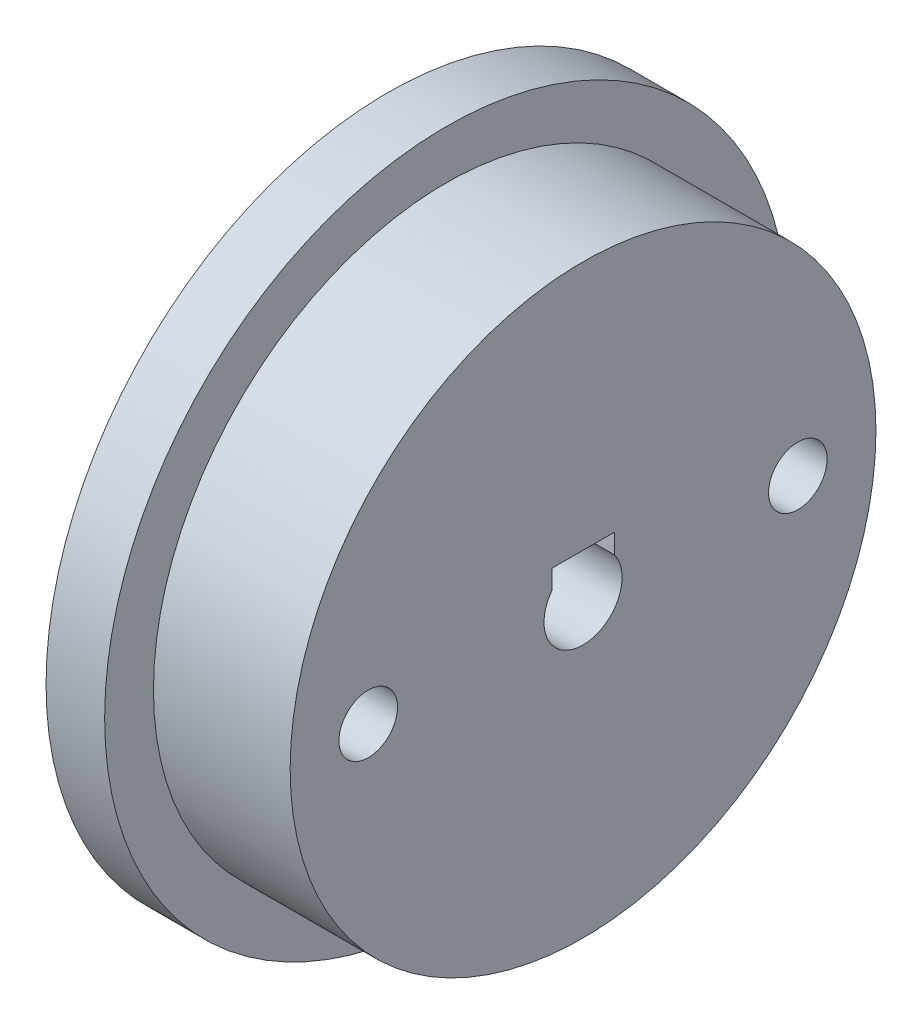
ISO-10303-21;
HEADER;
FILE_DESCRIPTION(('STEP AP214'),'2;1');
FILE_NAME('part.step','',(''),(''),'','','');
FILE_SCHEMA(('AUTOMOTIVE_DESIGN { 1 0 10303 214 1 1 1 1 }'));
ENDSEC;
DATA;
#1=APPLICATION_CONTEXT('core data for automotive mechanical design processes');
#2=APPLICATION_PROTOCOL_DEFINITION('international standard','automotive_design',2000,#1);
#3=PRODUCT_CONTEXT('',#1,'mechanical');
#4=PRODUCT('Part','Part','',(#3));
#5=PRODUCT_RELATED_PRODUCT_CATEGORY('part','',(#4));
#6=PRODUCT_DEFINITION_FORMATION('','',#4);
#7=PRODUCT_DEFINITION_CONTEXT('part definition',#1,'design');
#8=PRODUCT_DEFINITION('design','',#6,#7);
#9=PRODUCT_DEFINITION_SHAPE('','',#8);
#10=(LENGTH_UNIT() NAMED_UNIT(*) SI_UNIT(.MILLI.,.METRE.));
#11=(NAMED_UNIT(*) PLANE_ANGLE_UNIT() SI_UNIT($,.RADIAN.));
#12=(NAMED_UNIT(*) SI_UNIT($,.STERADIAN.) SOLID_ANGLE_UNIT());
#13=UNCERTAINTY_MEASURE_WITH_UNIT(LENGTH_MEASURE(1.E-05),#10,'distance_accuracy_value','');
#14=(GEOMETRIC_REPRESENTATION_CONTEXT(3) GLOBAL_UNCERTAINTY_ASSIGNED_CONTEXT((#13)) GLOBAL_UNIT_ASSIGNED_CONTEXT((#10,
#11,#12)) REPRESENTATION_CONTEXT('',''));
#15=CARTESIAN_POINT('',(0.,0.,0.));
#16=DIRECTION('',(0.,0.,1.));
#17=DIRECTION('',(1.,0.,0.));
#18=AXIS2_PLACEMENT_3D('',#15,#16,#17);
#19=CARTESIAN_POINT('',(0.,0.,0.));
#20=DIRECTION('',(1.,0.,0.));
#21=DIRECTION('',(0.,0.,-1.));
#22=AXIS2_PLACEMENT_3D('',#19,#20,#21);
#23=PLANE('',#22);
#24=CARTESIAN_POINT('',(0.,0.,11.));
#25=DIRECTION('',(1.,0.,0.));
#26=DIRECTION('',(0.,0.,-1.));
#27=AXIS2_PLACEMENT_3D('',#24,#25,#26);
#28=CIRCLE('',#27,1.5);
#29=CARTESIAN_POINT('',(0.,0.,9.5));
#30=VERTEX_POINT('',#29);
#31=EDGE_CURVE('E143',#30,#30,#28,.T.);
#32=ORIENTED_EDGE('',*,*,#31,.T.);
#33=EDGE_LOOP('',(#32));
#34=FACE_BOUND('',#33,.T.);
#35=DIRECTION('',(0.,-1.,0.));
#36=VECTOR('',#35,1.);
#37=CARTESIAN_POINT('',(0.,1.2,1.6));
#38=LINE('',#37,#36);
#39=CARTESIAN_POINT('',(0.,2.2,1.6));
#40=VERTEX_POINT('',#39);
#41=CARTESIAN_POINT('',(0.,1.2,1.6));
#42=VERTEX_POINT('',#41);
#43=EDGE_CURVE('E89',#40,#42,#38,.T.);
#44=ORIENTED_EDGE('',*,*,#43,.T.);
#45=CARTESIAN_POINT('',(0.,0.,0.));
#46=DIRECTION('',(1.,0.,0.));
#47=DIRECTION('',(0.,0.,-1.));
#48=AXIS2_PLACEMENT_3D('',#45,#46,#47);
#49=CIRCLE('',#48,2.);
#50=CARTESIAN_POINT('',(0.,1.2,-1.6));
#51=VERTEX_POINT('',#50);
#52=EDGE_CURVE('E82',#42,#51,#49,.T.);
#53=ORIENTED_EDGE('',*,*,#52,.T.);
#54=DIRECTION('',(0.,1.,0.));
#55=VECTOR('',#54,1.);
#56=CARTESIAN_POINT('',(0.,1.2,-1.6));
#57=LINE('',#56,#55);
#58=CARTESIAN_POINT('',(0.,2.2,-1.6));
#59=VERTEX_POINT('',#58);
#60=EDGE_CURVE('E92',#51,#59,#57,.T.);
#61=ORIENTED_EDGE('',*,*,#60,.T.);
#62=DIRECTION('',(0.,0.,1.));
#63=VECTOR('',#62,1.);
#64=CARTESIAN_POINT('',(0.,2.2,1.6));
#65=LINE('',#64,#63);
#66=EDGE_CURVE('E54',#59,#40,#65,.T.);
#67=ORIENTED_EDGE('',*,*,#66,.T.);
#68=EDGE_LOOP('',(#44,#53,#61,#67));
#69=FACE_BOUND('',#68,.T.);
#70=CARTESIAN_POINT('',(0.,0.,-11.));
#71=DIRECTION('',(1.,0.,0.));
#72=DIRECTION('',(0.,0.,1.));
#73=AXIS2_PLACEMENT_3D('',#70,#71,#72);
#74=CIRCLE('',#73,1.5);
#75=CARTESIAN_POINT('',(0.,0.,-9.5));
#76=VERTEX_POINT('',#75);
#77=EDGE_CURVE('E117',#76,#76,#74,.T.);
#78=ORIENTED_EDGE('',*,*,#77,.T.);
#79=EDGE_LOOP('',(#78));
#80=FACE_BOUND('',#79,.T.);
#81=CARTESIAN_POINT('',(0.,0.,0.));
#82=DIRECTION('',(-1.,0.,0.));
#83=DIRECTION('',(0.,0.,1.));
#84=AXIS2_PLACEMENT_3D('',#81,#82,#83);
#85=CIRCLE('',#84,17.5);
#86=CARTESIAN_POINT('',(0.,0.,17.5));
#87=VERTEX_POINT('',#86);
#88=EDGE_CURVE('E11',#87,#87,#85,.T.);
#89=ORIENTED_EDGE('',*,*,#88,.T.);
#90=EDGE_LOOP('',(#89));
#91=FACE_BOUND('',#90,.T.);
#92=ADVANCED_FACE('F39',(#34,#69,#80,#91),#23,.F.);
#93=CARTESIAN_POINT('',(0.,0.,0.));
#94=DIRECTION('',(-1.,0.,0.));
#95=DIRECTION('',(0.,0.,1.));
#96=AXIS2_PLACEMENT_3D('',#93,#94,#95);
#97=CYLINDRICAL_SURFACE('',#96,17.5);
#98=ORIENTED_EDGE('',*,*,#88,.F.);
#99=EDGE_LOOP('',(#98));
#100=FACE_BOUND('',#99,.T.);
#101=CARTESIAN_POINT('',(3.,0.,0.));
#102=DIRECTION('',(-1.,0.,0.));
#103=DIRECTION('',(0.,0.,1.));
#104=AXIS2_PLACEMENT_3D('',#101,#102,#103);
#105=CIRCLE('',#104,17.5);
#106=CARTESIAN_POINT('',(3.,0.,17.5));
#107=VERTEX_POINT('',#106);
#108=EDGE_CURVE('E47',#107,#107,#105,.T.);
#109=ORIENTED_EDGE('',*,*,#108,.T.);
#110=EDGE_LOOP('',(#109));
#111=FACE_BOUND('',#110,.T.);
#112=ADVANCED_FACE('F150',(#100,#111),#97,.T.);
#113=CARTESIAN_POINT('',(3.,17.5,0.));
#114=DIRECTION('',(-1.,0.,0.));
#115=DIRECTION('',(0.,0.,1.));
#116=AXIS2_PLACEMENT_3D('',#113,#114,#115);
#117=PLANE('',#116);
#118=ORIENTED_EDGE('',*,*,#108,.F.);
#119=EDGE_LOOP('',(#118));
#120=FACE_BOUND('',#119,.T.);
#121=CARTESIAN_POINT('',(3.,0.,0.));
#122=DIRECTION('',(-1.,0.,0.));
#123=DIRECTION('',(0.,0.,1.));
#124=AXIS2_PLACEMENT_3D('',#121,#122,#123);
#125=CIRCLE('',#124,15.);
#126=CARTESIAN_POINT('',(3.,0.,15.));
#127=VERTEX_POINT('',#126);
#128=EDGE_CURVE('E142',#127,#127,#125,.T.);
#129=ORIENTED_EDGE('',*,*,#128,.T.);
#130=EDGE_LOOP('',(#129));
#131=FACE_BOUND('',#130,.T.);
#132=ADVANCED_FACE('F152',(#120,#131),#117,.F.);
#133=CARTESIAN_POINT('',(0.,0.,0.));
#134=DIRECTION('',(-1.,0.,0.));
#135=DIRECTION('',(0.,0.,1.));
#136=AXIS2_PLACEMENT_3D('',#133,#134,#135);
#137=CYLINDRICAL_SURFACE('',#136,15.);
#138=ORIENTED_EDGE('',*,*,#128,.F.);
#139=EDGE_LOOP('',(#138));
#140=FACE_BOUND('',#139,.T.);
#141=CARTESIAN_POINT('',(10.,0.,0.));
#142=DIRECTION('',(-1.,0.,0.));
#143=DIRECTION('',(0.,0.,1.));
#144=AXIS2_PLACEMENT_3D('',#141,#142,#143);
#145=CIRCLE('',#144,15.);
#146=CARTESIAN_POINT('',(10.,0.,15.));
#147=VERTEX_POINT('',#146);
#148=EDGE_CURVE('E138',#147,#147,#145,.T.);
#149=ORIENTED_EDGE('',*,*,#148,.T.);
#150=EDGE_LOOP('',(#149));
#151=FACE_BOUND('',#150,.T.);
#152=ADVANCED_FACE('F155',(#140,#151),#137,.T.);
#153=CARTESIAN_POINT('',(10.,15.,0.));
#154=DIRECTION('',(-1.,0.,0.));
#155=DIRECTION('',(0.,0.,1.));
#156=AXIS2_PLACEMENT_3D('',#153,#154,#155);
#157=PLANE('',#156);
#158=CARTESIAN_POINT('',(10.,0.,11.));
#159=DIRECTION('',(1.,0.,0.));
#160=DIRECTION('',(0.,0.,-1.));
#161=AXIS2_PLACEMENT_3D('',#158,#159,#160);
#162=CIRCLE('',#161,1.5);
#163=CARTESIAN_POINT('',(10.,0.,9.5));
#164=VERTEX_POINT('',#163);
#165=EDGE_CURVE('E107',#164,#164,#162,.T.);
#166=ORIENTED_EDGE('',*,*,#165,.F.);
#167=EDGE_LOOP('',(#166));
#168=FACE_BOUND('',#167,.T.);
#169=DIRECTION('',(0.,1.,0.));
#170=VECTOR('',#169,1.);
#171=CARTESIAN_POINT('',(10.,1.2,-1.6));
#172=LINE('',#171,#170);
#173=CARTESIAN_POINT('',(10.,1.2,-1.6));
#174=VERTEX_POINT('',#173);
#175=CARTESIAN_POINT('',(10.,2.2,-1.6));
#176=VERTEX_POINT('',#175);
#177=EDGE_CURVE('E116',#174,#176,#172,.T.);
#178=ORIENTED_EDGE('',*,*,#177,.F.);
#179=CARTESIAN_POINT('',(10.,0.,0.));
#180=DIRECTION('',(1.,0.,0.));
#181=DIRECTION('',(0.,0.,-1.));
#182=AXIS2_PLACEMENT_3D('',#179,#180,#181);
#183=CIRCLE('',#182,2.);
#184=CARTESIAN_POINT('',(10.,1.2,1.6));
#185=VERTEX_POINT('',#184);
#186=EDGE_CURVE('E62',#185,#174,#183,.T.);
#187=ORIENTED_EDGE('',*,*,#186,.F.);
#188=DIRECTION('',(0.,-1.,0.));
#189=VECTOR('',#188,1.);
#190=CARTESIAN_POINT('',(10.,1.2,1.6));
#191=LINE('',#190,#189);
#192=CARTESIAN_POINT('',(10.,2.2,1.6));
#193=VERTEX_POINT('',#192);
#194=EDGE_CURVE('E100',#193,#185,#191,.T.);
#195=ORIENTED_EDGE('',*,*,#194,.F.);
#196=DIRECTION('',(0.,0.,1.));
#197=VECTOR('',#196,1.);
#198=CARTESIAN_POINT('',(10.,2.2,1.6));
#199=LINE('',#198,#197);
#200=EDGE_CURVE('E104',#176,#193,#199,.T.);
#201=ORIENTED_EDGE('',*,*,#200,.F.);
#202=EDGE_LOOP('',(#178,#187,#195,#201));
#203=FACE_BOUND('',#202,.T.);
#204=CARTESIAN_POINT('',(10.,0.,-11.));
#205=DIRECTION('',(1.,0.,0.));
#206=DIRECTION('',(0.,0.,1.));
#207=AXIS2_PLACEMENT_3D('',#204,#205,#206);
#208=CIRCLE('',#207,1.5);
#209=CARTESIAN_POINT('',(10.,0.,-9.5));
#210=VERTEX_POINT('',#209);
#211=EDGE_CURVE('E134',#210,#210,#208,.T.);
#212=ORIENTED_EDGE('',*,*,#211,.F.);
#213=EDGE_LOOP('',(#212));
#214=FACE_BOUND('',#213,.T.);
#215=ORIENTED_EDGE('',*,*,#148,.F.);
#216=EDGE_LOOP('',(#215));
#217=FACE_BOUND('',#216,.T.);
#218=ADVANCED_FACE('F161',(#168,#203,#214,#217),#157,.F.);
#219=CARTESIAN_POINT('',(0.,0.,-11.));
#220=DIRECTION('',(1.,0.,0.));
#221=DIRECTION('',(0.,0.,-1.));
#222=AXIS2_PLACEMENT_3D('',#219,#220,#221);
#223=CYLINDRICAL_SURFACE('',#222,1.5);
#224=ORIENTED_EDGE('',*,*,#77,.F.);
#225=EDGE_LOOP('',(#224));
#226=FACE_BOUND('',#225,.T.);
#227=ORIENTED_EDGE('',*,*,#211,.T.);
#228=EDGE_LOOP('',(#227));
#229=FACE_BOUND('',#228,.T.);
#230=ADVANCED_FACE('F166',(#226,#229),#223,.F.);
#231=CARTESIAN_POINT('',(0.,0.,0.));
#232=DIRECTION('',(1.,0.,0.));
#233=DIRECTION('',(0.,0.,-1.));
#234=AXIS2_PLACEMENT_3D('',#231,#232,#233);
#235=CYLINDRICAL_SURFACE('',#234,2.);
#236=ORIENTED_EDGE('',*,*,#186,.T.);
#237=DIRECTION('',(1.,0.,0.));
#238=VECTOR('',#237,1.);
#239=CARTESIAN_POINT('',(0.,1.2,-1.6));
#240=LINE('',#239,#238);
#241=EDGE_CURVE('E78',#51,#174,#240,.T.);
#242=ORIENTED_EDGE('',*,*,#241,.F.);
#243=ORIENTED_EDGE('',*,*,#52,.F.);
#244=DIRECTION('',(1.,0.,0.));
#245=VECTOR('',#244,1.);
#246=CARTESIAN_POINT('',(0.,1.2,1.6));
#247=LINE('',#246,#245);
#248=EDGE_CURVE('E123',#42,#185,#247,.T.);
#249=ORIENTED_EDGE('',*,*,#248,.T.);
#250=EDGE_LOOP('',(#236,#242,#243,#249));
#251=FACE_BOUND('',#250,.T.);
#252=ADVANCED_FACE('F80',(#251),#235,.F.);
#253=CARTESIAN_POINT('',(0.,1.2,1.6));
#254=DIRECTION('',(0.,0.,1.));
#255=DIRECTION('',(1.,0.,0.));
#256=AXIS2_PLACEMENT_3D('',#253,#254,#255);
#257=PLANE('',#256);
#258=ORIENTED_EDGE('',*,*,#194,.T.);
#259=ORIENTED_EDGE('',*,*,#248,.F.);
#260=ORIENTED_EDGE('',*,*,#43,.F.);
#261=DIRECTION('',(1.,0.,0.));
#262=VECTOR('',#261,1.);
#263=CARTESIAN_POINT('',(0.,2.2,1.6));
#264=LINE('',#263,#262);
#265=EDGE_CURVE('E126',#40,#193,#264,.T.);
#266=ORIENTED_EDGE('',*,*,#265,.T.);
#267=EDGE_LOOP('',(#258,#259,#260,#266));
#268=FACE_BOUND('',#267,.T.);
#269=ADVANCED_FACE('F198',(#268),#257,.F.);
#270=CARTESIAN_POINT('',(0.,2.2,1.6));
#271=DIRECTION('',(0.,1.,0.));
#272=DIRECTION('',(0.,0.,1.));
#273=AXIS2_PLACEMENT_3D('',#270,#271,#272);
#274=PLANE('',#273);
#275=ORIENTED_EDGE('',*,*,#200,.T.);
#276=ORIENTED_EDGE('',*,*,#265,.F.);
#277=ORIENTED_EDGE('',*,*,#66,.F.);
#278=DIRECTION('',(1.,0.,0.));
#279=VECTOR('',#278,1.);
#280=CARTESIAN_POINT('',(0.,2.2,-1.6));
#281=LINE('',#280,#279);
#282=EDGE_CURVE('E88',#59,#176,#281,.T.);
#283=ORIENTED_EDGE('',*,*,#282,.T.);
#284=EDGE_LOOP('',(#275,#276,#277,#283));
#285=FACE_BOUND('',#284,.T.);
#286=ADVANCED_FACE('F195',(#285),#274,.F.);
#287=CARTESIAN_POINT('',(0.,1.2,-1.6));
#288=DIRECTION('',(0.,0.,-1.));
#289=DIRECTION('',(-1.,0.,0.));
#290=AXIS2_PLACEMENT_3D('',#287,#288,#289);
#291=PLANE('',#290);
#292=ORIENTED_EDGE('',*,*,#177,.T.);
#293=ORIENTED_EDGE('',*,*,#282,.F.);
#294=ORIENTED_EDGE('',*,*,#60,.F.);
#295=ORIENTED_EDGE('',*,*,#241,.T.);
#296=EDGE_LOOP('',(#292,#293,#294,#295));
#297=FACE_BOUND('',#296,.T.);
#298=ADVANCED_FACE('F93',(#297),#291,.F.);
#299=CARTESIAN_POINT('',(0.,0.,11.));
#300=DIRECTION('',(1.,0.,0.));
#301=DIRECTION('',(0.,0.,-1.));
#302=AXIS2_PLACEMENT_3D('',#299,#300,#301);
#303=CYLINDRICAL_SURFACE('',#302,1.5);
#304=ORIENTED_EDGE('',*,*,#31,.F.);
#305=EDGE_LOOP('',(#304));
#306=FACE_BOUND('',#305,.T.);
#307=ORIENTED_EDGE('',*,*,#165,.T.);
#308=EDGE_LOOP('',(#307));
#309=FACE_BOUND('',#308,.T.);
#310=ADVANCED_FACE('F189',(#306,#309),#303,.F.);
#311=CLOSED_SHELL('',(#92,#112,#132,#152,#218,#230,#252,#269,#286,#298,#310));
#312=MANIFOLD_SOLID_BREP('B2',#311);
#313=ADVANCED_BREP_SHAPE_REPRESENTATION('',(#18,#312),#14);
#314=SHAPE_DEFINITION_REPRESENTATION(#9,#313);
ENDSEC;
END-ISO-10303-21;
